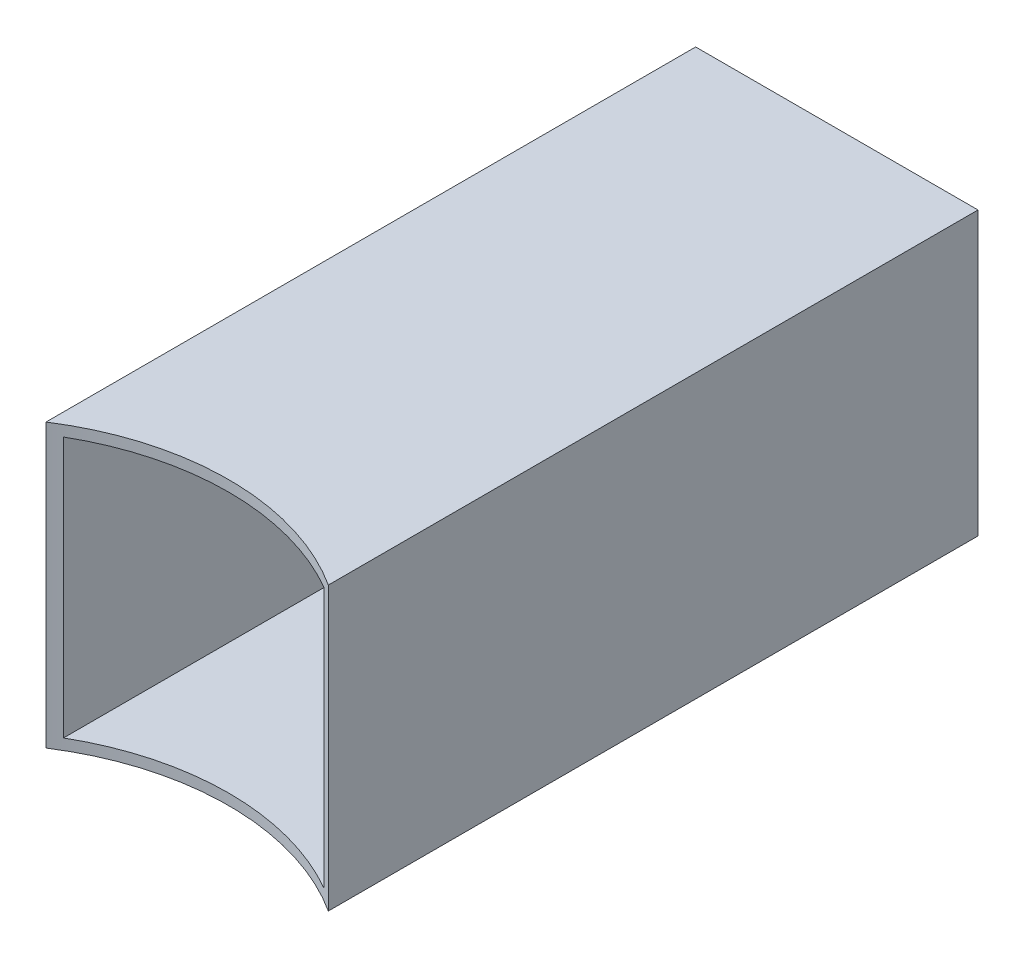
ISO-10303-21;
HEADER;
FILE_DESCRIPTION(('STEP AP214'),'2;1');
FILE_NAME('part.step','',(''),(''),'','','');
FILE_SCHEMA(('AUTOMOTIVE_DESIGN { 1 0 10303 214 1 1 1 1 }'));
ENDSEC;
DATA;
#1=APPLICATION_CONTEXT('core data for automotive mechanical design processes');
#2=APPLICATION_PROTOCOL_DEFINITION('international standard','automotive_design',2000,#1);
#3=PRODUCT_CONTEXT('',#1,'mechanical');
#4=PRODUCT('Part','Part','',(#3));
#5=PRODUCT_RELATED_PRODUCT_CATEGORY('part','',(#4));
#6=PRODUCT_DEFINITION_FORMATION('','',#4);
#7=PRODUCT_DEFINITION_CONTEXT('part definition',#1,'design');
#8=PRODUCT_DEFINITION('design','',#6,#7);
#9=PRODUCT_DEFINITION_SHAPE('','',#8);
#10=(LENGTH_UNIT() NAMED_UNIT(*) SI_UNIT(.MILLI.,.METRE.));
#11=(NAMED_UNIT(*) PLANE_ANGLE_UNIT() SI_UNIT($,.RADIAN.));
#12=(NAMED_UNIT(*) SI_UNIT($,.STERADIAN.) SOLID_ANGLE_UNIT());
#13=UNCERTAINTY_MEASURE_WITH_UNIT(LENGTH_MEASURE(1.E-05),#10,'distance_accuracy_value','');
#14=(GEOMETRIC_REPRESENTATION_CONTEXT(3) GLOBAL_UNCERTAINTY_ASSIGNED_CONTEXT((#13)) GLOBAL_UNIT_ASSIGNED_CONTEXT((#10,
#11,#12)) REPRESENTATION_CONTEXT('',''));
#15=CARTESIAN_POINT('',(0.,0.,0.));
#16=DIRECTION('',(0.,0.,1.));
#17=DIRECTION('',(1.,0.,0.));
#18=AXIS2_PLACEMENT_3D('',#15,#16,#17);
#19=CARTESIAN_POINT('',(6.5,6.5,40.));
#20=DIRECTION('',(-1.,0.,0.));
#21=DIRECTION('',(0.,0.,1.));
#22=AXIS2_PLACEMENT_3D('',#19,#20,#21);
#23=PLANE('',#22);
#24=DIRECTION('',(0.,0.,-1.));
#25=VECTOR('',#24,1.);
#26=CARTESIAN_POINT('',(6.5,6.5,40.));
#27=LINE('',#26,#25);
#28=CARTESIAN_POINT('',(6.5,6.5,29.912879499084));
#29=VERTEX_POINT('',#28);
#30=CARTESIAN_POINT('',(6.5,6.5,0.));
#31=VERTEX_POINT('',#30);
#32=EDGE_CURVE('E47',#29,#31,#27,.T.);
#33=ORIENTED_EDGE('',*,*,#32,.F.);
#34=DIRECTION('',(0.,1.,0.));
#35=VECTOR('',#34,1.);
#36=CARTESIAN_POINT('',(6.5,-19.5,29.912879499084));
#37=LINE('',#36,#35);
#38=CARTESIAN_POINT('',(6.5,-6.5,29.912879499084));
#39=VERTEX_POINT('',#38);
#40=EDGE_CURVE('E101',#29,#39,#37,.F.);
#41=ORIENTED_EDGE('',*,*,#40,.T.);
#42=DIRECTION('',(0.,0.,-1.));
#43=VECTOR('',#42,1.);
#44=CARTESIAN_POINT('',(6.5,-6.5,40.));
#45=LINE('',#44,#43);
#46=CARTESIAN_POINT('',(6.5,-6.5,0.));
#47=VERTEX_POINT('',#46);
#48=EDGE_CURVE('E130',#39,#47,#45,.T.);
#49=ORIENTED_EDGE('',*,*,#48,.T.);
#50=DIRECTION('',(0.,1.,0.));
#51=VECTOR('',#50,1.);
#52=CARTESIAN_POINT('',(6.5,6.5,0.));
#53=LINE('',#52,#51);
#54=EDGE_CURVE('E122',#47,#31,#53,.T.);
#55=ORIENTED_EDGE('',*,*,#54,.T.);
#56=EDGE_LOOP('',(#33,#41,#49,#55));
#57=FACE_BOUND('',#56,.T.);
#58=ADVANCED_FACE('F39',(#57),#23,.F.);
#59=CARTESIAN_POINT('',(-6.5,6.5,40.));
#60=DIRECTION('',(0.,-1.,0.));
#61=DIRECTION('',(0.,0.,-1.));
#62=AXIS2_PLACEMENT_3D('',#59,#60,#61);
#63=PLANE('',#62);
#64=DIRECTION('',(0.,0.,-1.));
#65=VECTOR('',#64,1.);
#66=CARTESIAN_POINT('',(-6.5,6.5,40.));
#67=LINE('',#66,#65);
#68=CARTESIAN_POINT('',(-6.5,6.5,29.912879499084));
#69=VERTEX_POINT('',#68);
#70=CARTESIAN_POINT('',(-6.5,6.5,0.));
#71=VERTEX_POINT('',#70);
#72=EDGE_CURVE('E117',#69,#71,#67,.T.);
#73=ORIENTED_EDGE('',*,*,#72,.F.);
#74=CARTESIAN_POINT('',(0.,6.5,40.));
#75=DIRECTION('',(0.,1.,0.));
#76=DIRECTION('',(0.,0.,1.));
#77=AXIS2_PLACEMENT_3D('',#74,#75,#76);
#78=CIRCLE('',#77,12.);
#79=EDGE_CURVE('E104',#29,#69,#78,.T.);
#80=ORIENTED_EDGE('',*,*,#79,.F.);
#81=ORIENTED_EDGE('',*,*,#32,.T.);
#82=DIRECTION('',(-1.,0.,0.));
#83=VECTOR('',#82,1.);
#84=CARTESIAN_POINT('',(-6.5,6.5,0.));
#85=LINE('',#84,#83);
#86=EDGE_CURVE('E141',#31,#71,#85,.T.);
#87=ORIENTED_EDGE('',*,*,#86,.T.);
#88=EDGE_LOOP('',(#73,#80,#81,#87));
#89=FACE_BOUND('',#88,.T.);
#90=ADVANCED_FACE('F114',(#89),#63,.F.);
#91=CARTESIAN_POINT('',(-6.5,6.5,40.));
#92=DIRECTION('',(1.,0.,0.));
#93=DIRECTION('',(0.,1.,0.));
#94=AXIS2_PLACEMENT_3D('',#91,#92,#93);
#95=PLANE('',#94);
#96=DIRECTION('',(0.,0.,-1.));
#97=VECTOR('',#96,1.);
#98=CARTESIAN_POINT('',(-6.5,-6.5,40.));
#99=LINE('',#98,#97);
#100=CARTESIAN_POINT('',(-6.5,-6.5,29.912879499084));
#101=VERTEX_POINT('',#100);
#102=CARTESIAN_POINT('',(-6.5,-6.5,0.));
#103=VERTEX_POINT('',#102);
#104=EDGE_CURVE('E125',#101,#103,#99,.T.);
#105=ORIENTED_EDGE('',*,*,#104,.F.);
#106=DIRECTION('',(0.,1.,0.));
#107=VECTOR('',#106,1.);
#108=CARTESIAN_POINT('',(-6.5,-19.5,29.912879499084));
#109=LINE('',#108,#107);
#110=EDGE_CURVE('E54',#101,#69,#109,.T.);
#111=ORIENTED_EDGE('',*,*,#110,.T.);
#112=ORIENTED_EDGE('',*,*,#72,.T.);
#113=DIRECTION('',(0.,-1.,0.));
#114=VECTOR('',#113,1.);
#115=CARTESIAN_POINT('',(-6.5,6.5,0.));
#116=LINE('',#115,#114);
#117=EDGE_CURVE('E137',#71,#103,#116,.T.);
#118=ORIENTED_EDGE('',*,*,#117,.T.);
#119=EDGE_LOOP('',(#105,#111,#112,#118));
#120=FACE_BOUND('',#119,.T.);
#121=ADVANCED_FACE('F219',(#120),#95,.F.);
#122=CARTESIAN_POINT('',(-6.5,-6.5,40.));
#123=DIRECTION('',(0.,1.,0.));
#124=DIRECTION('',(0.,0.,1.));
#125=AXIS2_PLACEMENT_3D('',#122,#123,#124);
#126=PLANE('',#125);
#127=ORIENTED_EDGE('',*,*,#48,.F.);
#128=CARTESIAN_POINT('',(0.,-6.5,40.));
#129=DIRECTION('',(0.,1.,0.));
#130=DIRECTION('',(0.,0.,1.));
#131=AXIS2_PLACEMENT_3D('',#128,#129,#130);
#132=CIRCLE('',#131,12.);
#133=EDGE_CURVE('E105',#39,#101,#132,.T.);
#134=ORIENTED_EDGE('',*,*,#133,.T.);
#135=ORIENTED_EDGE('',*,*,#104,.T.);
#136=DIRECTION('',(1.,0.,0.));
#137=VECTOR('',#136,1.);
#138=CARTESIAN_POINT('',(-6.5,-6.5,0.));
#139=LINE('',#138,#137);
#140=EDGE_CURVE('E133',#103,#47,#139,.T.);
#141=ORIENTED_EDGE('',*,*,#140,.T.);
#142=EDGE_LOOP('',(#127,#134,#135,#141));
#143=FACE_BOUND('',#142,.T.);
#144=ADVANCED_FACE('F212',(#143),#126,.F.);
#145=CARTESIAN_POINT('',(0.,0.,0.));
#146=DIRECTION('',(0.,0.,1.));
#147=DIRECTION('',(1.,0.,0.));
#148=AXIS2_PLACEMENT_3D('',#145,#146,#147);
#149=PLANE('',#148);
#150=DIRECTION('',(-1.,0.,0.));
#151=VECTOR('',#150,1.);
#152=CARTESIAN_POINT('',(-6.,-6.,0.));
#153=LINE('',#152,#151);
#154=CARTESIAN_POINT('',(6.,-6.,0.));
#155=VERTEX_POINT('',#154);
#156=CARTESIAN_POINT('',(-6.,-6.,0.));
#157=VERTEX_POINT('',#156);
#158=EDGE_CURVE('E170',#155,#157,#153,.T.);
#159=ORIENTED_EDGE('',*,*,#158,.F.);
#160=DIRECTION('',(0.,-1.,0.));
#161=VECTOR('',#160,1.);
#162=CARTESIAN_POINT('',(6.,6.,0.));
#163=LINE('',#162,#161);
#164=CARTESIAN_POINT('',(6.,6.,0.));
#165=VERTEX_POINT('',#164);
#166=EDGE_CURVE('E156',#165,#155,#163,.T.);
#167=ORIENTED_EDGE('',*,*,#166,.F.);
#168=DIRECTION('',(1.,0.,0.));
#169=VECTOR('',#168,1.);
#170=CARTESIAN_POINT('',(-6.,6.,0.));
#171=LINE('',#170,#169);
#172=CARTESIAN_POINT('',(-6.,6.,0.));
#173=VERTEX_POINT('',#172);
#174=EDGE_CURVE('E146',#173,#165,#171,.T.);
#175=ORIENTED_EDGE('',*,*,#174,.F.);
#176=DIRECTION('',(0.,1.,0.));
#177=VECTOR('',#176,1.);
#178=CARTESIAN_POINT('',(-6.,6.,0.));
#179=LINE('',#178,#177);
#180=EDGE_CURVE('E110',#157,#173,#179,.T.);
#181=ORIENTED_EDGE('',*,*,#180,.F.);
#182=EDGE_LOOP('',(#159,#167,#175,#181));
#183=FACE_BOUND('',#182,.T.);
#184=ORIENTED_EDGE('',*,*,#54,.F.);
#185=ORIENTED_EDGE('',*,*,#140,.F.);
#186=ORIENTED_EDGE('',*,*,#117,.F.);
#187=ORIENTED_EDGE('',*,*,#86,.F.);
#188=EDGE_LOOP('',(#184,#185,#186,#187));
#189=FACE_BOUND('',#188,.T.);
#190=ADVANCED_FACE('F199',(#183,#189),#149,.F.);
#191=CARTESIAN_POINT('',(6.,6.,-0.001000000000001));
#192=DIRECTION('',(1.,0.,0.));
#193=DIRECTION('',(0.,1.,0.));
#194=AXIS2_PLACEMENT_3D('',#191,#192,#193);
#195=PLANE('',#194);
#196=DIRECTION('',(0.,0.,1.));
#197=VECTOR('',#196,1.);
#198=CARTESIAN_POINT('',(6.,-6.,-0.001000000000001));
#199=LINE('',#198,#197);
#200=CARTESIAN_POINT('',(6.,-6.,29.6076951545867));
#201=VERTEX_POINT('',#200);
#202=EDGE_CURVE('E150',#155,#201,#199,.T.);
#203=ORIENTED_EDGE('',*,*,#202,.T.);
#204=DIRECTION('',(0.,1.,0.));
#205=VECTOR('',#204,1.);
#206=CARTESIAN_POINT('',(6.,-19.5,29.6076951545867));
#207=LINE('',#206,#205);
#208=CARTESIAN_POINT('',(6.,6.,29.6076951545867));
#209=VERTEX_POINT('',#208);
#210=EDGE_CURVE('E180',#201,#209,#207,.T.);
#211=ORIENTED_EDGE('',*,*,#210,.T.);
#212=DIRECTION('',(0.,0.,1.));
#213=VECTOR('',#212,1.);
#214=CARTESIAN_POINT('',(6.,6.,-0.001000000000001));
#215=LINE('',#214,#213);
#216=EDGE_CURVE('E151',#165,#209,#215,.T.);
#217=ORIENTED_EDGE('',*,*,#216,.F.);
#218=ORIENTED_EDGE('',*,*,#166,.T.);
#219=EDGE_LOOP('',(#203,#211,#217,#218));
#220=FACE_BOUND('',#219,.T.);
#221=ADVANCED_FACE('F204',(#220),#195,.F.);
#222=CARTESIAN_POINT('',(-6.,-6.,-0.001000000000001));
#223=DIRECTION('',(0.,-1.,0.));
#224=DIRECTION('',(0.,0.,-1.));
#225=AXIS2_PLACEMENT_3D('',#222,#223,#224);
#226=PLANE('',#225);
#227=DIRECTION('',(0.,0.,1.));
#228=VECTOR('',#227,1.);
#229=CARTESIAN_POINT('',(-6.,-6.,-0.001000000000001));
#230=LINE('',#229,#228);
#231=CARTESIAN_POINT('',(-6.,-6.,29.6076951545867));
#232=VERTEX_POINT('',#231);
#233=EDGE_CURVE('E160',#157,#232,#230,.T.);
#234=ORIENTED_EDGE('',*,*,#233,.T.);
#235=CARTESIAN_POINT('',(0.,-6.,40.));
#236=DIRECTION('',(0.,-1.,0.));
#237=DIRECTION('',(0.,0.,-1.));
#238=AXIS2_PLACEMENT_3D('',#235,#236,#237);
#239=CIRCLE('',#238,12.);
#240=EDGE_CURVE('E184',#232,#201,#239,.T.);
#241=ORIENTED_EDGE('',*,*,#240,.T.);
#242=ORIENTED_EDGE('',*,*,#202,.F.);
#243=ORIENTED_EDGE('',*,*,#158,.T.);
#244=EDGE_LOOP('',(#234,#241,#242,#243));
#245=FACE_BOUND('',#244,.T.);
#246=ADVANCED_FACE('F193',(#245),#226,.F.);
#247=CARTESIAN_POINT('',(-6.,6.,-0.001000000000001));
#248=DIRECTION('',(-1.,0.,0.));
#249=DIRECTION('',(0.,-1.,0.));
#250=AXIS2_PLACEMENT_3D('',#247,#248,#249);
#251=PLANE('',#250);
#252=DIRECTION('',(0.,0.,1.));
#253=VECTOR('',#252,1.);
#254=CARTESIAN_POINT('',(-6.,6.,-0.001000000000001));
#255=LINE('',#254,#253);
#256=CARTESIAN_POINT('',(-6.,6.,29.6076951545867));
#257=VERTEX_POINT('',#256);
#258=EDGE_CURVE('E155',#173,#257,#255,.T.);
#259=ORIENTED_EDGE('',*,*,#258,.T.);
#260=DIRECTION('',(0.,1.,0.));
#261=VECTOR('',#260,1.);
#262=CARTESIAN_POINT('',(-6.,-19.5,29.6076951545867));
#263=LINE('',#262,#261);
#264=EDGE_CURVE('E62',#257,#232,#263,.F.);
#265=ORIENTED_EDGE('',*,*,#264,.T.);
#266=ORIENTED_EDGE('',*,*,#233,.F.);
#267=ORIENTED_EDGE('',*,*,#180,.T.);
#268=EDGE_LOOP('',(#259,#265,#266,#267));
#269=FACE_BOUND('',#268,.T.);
#270=ADVANCED_FACE('F190',(#269),#251,.F.);
#271=CARTESIAN_POINT('',(-6.,6.,-0.001000000000001));
#272=DIRECTION('',(0.,1.,0.));
#273=DIRECTION('',(0.,0.,1.));
#274=AXIS2_PLACEMENT_3D('',#271,#272,#273);
#275=PLANE('',#274);
#276=ORIENTED_EDGE('',*,*,#216,.T.);
#277=CARTESIAN_POINT('',(0.,6.,40.));
#278=DIRECTION('',(0.,1.,0.));
#279=DIRECTION('',(0.,0.,1.));
#280=AXIS2_PLACEMENT_3D('',#277,#278,#279);
#281=CIRCLE('',#280,12.);
#282=EDGE_CURVE('E11',#209,#257,#281,.T.);
#283=ORIENTED_EDGE('',*,*,#282,.T.);
#284=ORIENTED_EDGE('',*,*,#258,.F.);
#285=ORIENTED_EDGE('',*,*,#174,.T.);
#286=EDGE_LOOP('',(#276,#283,#284,#285));
#287=FACE_BOUND('',#286,.T.);
#288=ADVANCED_FACE('F202',(#287),#275,.F.);
#289=CARTESIAN_POINT('',(0.,-19.5,40.));
#290=DIRECTION('',(0.,1.,0.));
#291=DIRECTION('',(0.,0.,1.));
#292=AXIS2_PLACEMENT_3D('',#289,#290,#291);
#293=CYLINDRICAL_SURFACE('',#292,12.);
#294=ORIENTED_EDGE('',*,*,#240,.F.);
#295=ORIENTED_EDGE('',*,*,#264,.F.);
#296=ORIENTED_EDGE('',*,*,#282,.F.);
#297=ORIENTED_EDGE('',*,*,#210,.F.);
#298=EDGE_LOOP('',(#294,#295,#296,#297));
#299=FACE_BOUND('',#298,.T.);
#300=ORIENTED_EDGE('',*,*,#79,.T.);
#301=ORIENTED_EDGE('',*,*,#110,.F.);
#302=ORIENTED_EDGE('',*,*,#133,.F.);
#303=ORIENTED_EDGE('',*,*,#40,.F.);
#304=EDGE_LOOP('',(#300,#301,#302,#303));
#305=FACE_BOUND('',#304,.T.);
#306=ADVANCED_FACE('F103',(#299,#305),#293,.F.);
#307=CLOSED_SHELL('',(#58,#90,#121,#144,#190,#221,#246,#270,#288,#306));
#308=MANIFOLD_SOLID_BREP('B2',#307);
#309=ADVANCED_BREP_SHAPE_REPRESENTATION('',(#18,#308),#14);
#310=SHAPE_DEFINITION_REPRESENTATION(#9,#309);
ENDSEC;
END-ISO-10303-21;
